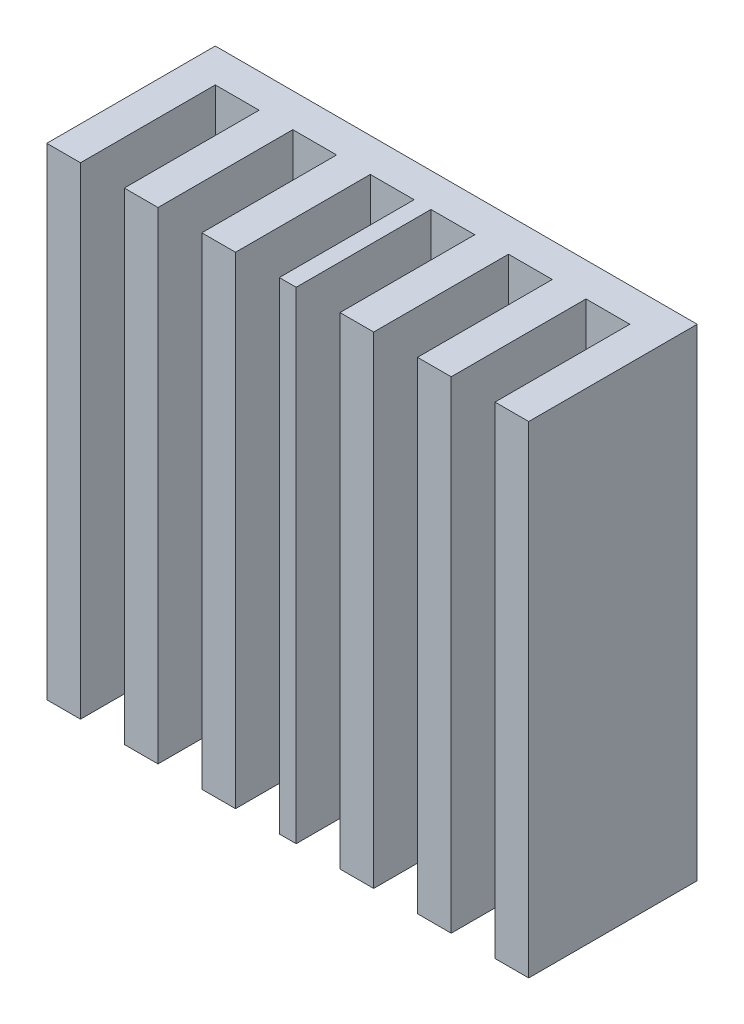
ISO-10303-21;
HEADER;
FILE_DESCRIPTION(('STEP AP214'),'2;1');
FILE_NAME('part.step','',(''),(''),'','','');
FILE_SCHEMA(('AUTOMOTIVE_DESIGN { 1 0 10303 214 1 1 1 1 }'));
ENDSEC;
DATA;
#1=APPLICATION_CONTEXT('core data for automotive mechanical design processes');
#2=APPLICATION_PROTOCOL_DEFINITION('international standard','automotive_design',2000,#1);
#3=PRODUCT_CONTEXT('',#1,'mechanical');
#4=PRODUCT('Part','Part','',(#3));
#5=PRODUCT_RELATED_PRODUCT_CATEGORY('part','',(#4));
#6=PRODUCT_DEFINITION_FORMATION('','',#4);
#7=PRODUCT_DEFINITION_CONTEXT('part definition',#1,'design');
#8=PRODUCT_DEFINITION('design','',#6,#7);
#9=PRODUCT_DEFINITION_SHAPE('','',#8);
#10=(LENGTH_UNIT() NAMED_UNIT(*) SI_UNIT(.MILLI.,.METRE.));
#11=(NAMED_UNIT(*) PLANE_ANGLE_UNIT() SI_UNIT($,.RADIAN.));
#12=(NAMED_UNIT(*) SI_UNIT($,.STERADIAN.) SOLID_ANGLE_UNIT());
#13=UNCERTAINTY_MEASURE_WITH_UNIT(LENGTH_MEASURE(1.E-05),#10,'distance_accuracy_value','');
#14=(GEOMETRIC_REPRESENTATION_CONTEXT(3) GLOBAL_UNCERTAINTY_ASSIGNED_CONTEXT((#13)) GLOBAL_UNIT_ASSIGNED_CONTEXT((#10,
#11,#12)) REPRESENTATION_CONTEXT('',''));
#15=CARTESIAN_POINT('',(0.,0.,0.));
#16=DIRECTION('',(0.,0.,1.));
#17=DIRECTION('',(1.,0.,0.));
#18=AXIS2_PLACEMENT_3D('',#15,#16,#17);
#19=CARTESIAN_POINT('',(0.,0.,5.));
#20=DIRECTION('',(0.,0.,-1.));
#21=DIRECTION('',(-1.,0.,0.));
#22=AXIS2_PLACEMENT_3D('',#19,#20,#21);
#23=PLANE('',#22);
#24=DIRECTION('',(-1.,0.,0.));
#25=VECTOR('',#24,1.);
#26=CARTESIAN_POINT('',(0.,14.3,5.));
#27=LINE('',#26,#25);
#28=CARTESIAN_POINT('',(14.3,14.3,5.));
#29=VERTEX_POINT('',#28);
#30=CARTESIAN_POINT('',(13.3,14.3,5.));
#31=VERTEX_POINT('',#30);
#32=EDGE_CURVE('E389',#29,#31,#27,.T.);
#33=ORIENTED_EDGE('',*,*,#32,.T.);
#34=DIRECTION('',(0.,1.,0.));
#35=VECTOR('',#34,1.);
#36=CARTESIAN_POINT('',(13.3,14.3,5.));
#37=LINE('',#36,#35);
#38=CARTESIAN_POINT('',(13.3,0.,5.));
#39=VERTEX_POINT('',#38);
#40=EDGE_CURVE('E234',#39,#31,#37,.T.);
#41=ORIENTED_EDGE('',*,*,#40,.F.);
#42=DIRECTION('',(1.,0.,0.));
#43=VECTOR('',#42,1.);
#44=CARTESIAN_POINT('',(0.,0.,5.));
#45=LINE('',#44,#43);
#46=CARTESIAN_POINT('',(14.3,0.,5.));
#47=VERTEX_POINT('',#46);
#48=EDGE_CURVE('E380',#39,#47,#45,.T.);
#49=ORIENTED_EDGE('',*,*,#48,.T.);
#50=DIRECTION('',(0.,1.,0.));
#51=VECTOR('',#50,1.);
#52=CARTESIAN_POINT('',(14.3,0.,5.));
#53=LINE('',#52,#51);
#54=EDGE_CURVE('E385',#47,#29,#53,.T.);
#55=ORIENTED_EDGE('',*,*,#54,.T.);
#56=EDGE_LOOP('',(#33,#41,#49,#55));
#57=FACE_BOUND('',#56,.T.);
#58=ADVANCED_FACE('F33',(#57),#23,.F.);
#59=CARTESIAN_POINT('',(11.,0.,5.));
#60=VERTEX_POINT('',#59);
#61=CARTESIAN_POINT('',(12.,0.,5.));
#62=VERTEX_POINT('',#61);
#63=EDGE_CURVE('E464',#60,#62,#45,.T.);
#64=ORIENTED_EDGE('',*,*,#63,.T.);
#65=DIRECTION('',(0.,-1.,0.));
#66=VECTOR('',#65,1.);
#67=CARTESIAN_POINT('',(12.,14.3,5.));
#68=LINE('',#67,#66);
#69=CARTESIAN_POINT('',(12.,14.3,5.));
#70=VERTEX_POINT('',#69);
#71=EDGE_CURVE('E452',#70,#62,#68,.T.);
#72=ORIENTED_EDGE('',*,*,#71,.F.);
#73=CARTESIAN_POINT('',(11.,14.3,5.));
#74=VERTEX_POINT('',#73);
#75=EDGE_CURVE('E239',#70,#74,#27,.T.);
#76=ORIENTED_EDGE('',*,*,#75,.T.);
#77=DIRECTION('',(0.,1.,0.));
#78=VECTOR('',#77,1.);
#79=CARTESIAN_POINT('',(11.,14.3,5.));
#80=LINE('',#79,#78);
#81=EDGE_CURVE('E249',#60,#74,#80,.T.);
#82=ORIENTED_EDGE('',*,*,#81,.F.);
#83=EDGE_LOOP('',(#64,#72,#76,#82));
#84=FACE_BOUND('',#83,.T.);
#85=ADVANCED_FACE('F450',(#84),#23,.F.);
#86=CARTESIAN_POINT('',(8.7,0.,5.));
#87=VERTEX_POINT('',#86);
#88=CARTESIAN_POINT('',(9.7,0.,5.));
#89=VERTEX_POINT('',#88);
#90=EDGE_CURVE('E465',#87,#89,#45,.T.);
#91=ORIENTED_EDGE('',*,*,#90,.T.);
#92=DIRECTION('',(0.,-1.,0.));
#93=VECTOR('',#92,1.);
#94=CARTESIAN_POINT('',(9.7,14.3,5.));
#95=LINE('',#94,#93);
#96=CARTESIAN_POINT('',(9.7,14.3,5.));
#97=VERTEX_POINT('',#96);
#98=EDGE_CURVE('E256',#97,#89,#95,.T.);
#99=ORIENTED_EDGE('',*,*,#98,.F.);
#100=CARTESIAN_POINT('',(8.7,14.3,5.));
#101=VERTEX_POINT('',#100);
#102=EDGE_CURVE('E438',#97,#101,#27,.T.);
#103=ORIENTED_EDGE('',*,*,#102,.T.);
#104=DIRECTION('',(0.,1.,0.));
#105=VECTOR('',#104,1.);
#106=CARTESIAN_POINT('',(8.7,14.3,5.));
#107=LINE('',#106,#105);
#108=EDGE_CURVE('E274',#87,#101,#107,.T.);
#109=ORIENTED_EDGE('',*,*,#108,.F.);
#110=EDGE_LOOP('',(#91,#99,#103,#109));
#111=FACE_BOUND('',#110,.T.);
#112=ADVANCED_FACE('F492',(#111),#23,.F.);
#113=CARTESIAN_POINT('',(4.6,0.,5.));
#114=VERTEX_POINT('',#113);
#115=CARTESIAN_POINT('',(5.6,0.,5.));
#116=VERTEX_POINT('',#115);
#117=EDGE_CURVE('E516',#114,#116,#45,.T.);
#118=ORIENTED_EDGE('',*,*,#117,.T.);
#119=DIRECTION('',(0.,-1.,0.));
#120=VECTOR('',#119,1.);
#121=CARTESIAN_POINT('',(5.6,14.3,5.));
#122=LINE('',#121,#120);
#123=CARTESIAN_POINT('',(5.6,14.3,5.));
#124=VERTEX_POINT('',#123);
#125=EDGE_CURVE('E289',#124,#116,#122,.T.);
#126=ORIENTED_EDGE('',*,*,#125,.F.);
#127=CARTESIAN_POINT('',(4.6,14.3,5.));
#128=VERTEX_POINT('',#127);
#129=EDGE_CURVE('E428',#124,#128,#27,.T.);
#130=ORIENTED_EDGE('',*,*,#129,.T.);
#131=DIRECTION('',(0.,1.,0.));
#132=VECTOR('',#131,1.);
#133=CARTESIAN_POINT('',(4.6,14.3,5.));
#134=LINE('',#133,#132);
#135=EDGE_CURVE('E327',#114,#128,#134,.T.);
#136=ORIENTED_EDGE('',*,*,#135,.F.);
#137=EDGE_LOOP('',(#118,#126,#130,#136));
#138=FACE_BOUND('',#137,.T.);
#139=ADVANCED_FACE('F509',(#138),#23,.F.);
#140=CARTESIAN_POINT('',(2.3,0.,5.));
#141=VERTEX_POINT('',#140);
#142=CARTESIAN_POINT('',(3.3,0.,5.));
#143=VERTEX_POINT('',#142);
#144=EDGE_CURVE('E386',#141,#143,#45,.T.);
#145=ORIENTED_EDGE('',*,*,#144,.T.);
#146=DIRECTION('',(0.,-1.,0.));
#147=VECTOR('',#146,1.);
#148=CARTESIAN_POINT('',(3.3,14.3,5.));
#149=LINE('',#148,#147);
#150=CARTESIAN_POINT('',(3.3,14.3,5.));
#151=VERTEX_POINT('',#150);
#152=EDGE_CURVE('E315',#151,#143,#149,.T.);
#153=ORIENTED_EDGE('',*,*,#152,.F.);
#154=CARTESIAN_POINT('',(2.3,14.3,5.));
#155=VERTEX_POINT('',#154);
#156=EDGE_CURVE('E427',#151,#155,#27,.T.);
#157=ORIENTED_EDGE('',*,*,#156,.T.);
#158=DIRECTION('',(0.,1.,0.));
#159=VECTOR('',#158,1.);
#160=CARTESIAN_POINT('',(2.3,14.3,5.));
#161=LINE('',#160,#159);
#162=EDGE_CURVE('E354',#141,#155,#161,.T.);
#163=ORIENTED_EDGE('',*,*,#162,.F.);
#164=EDGE_LOOP('',(#145,#153,#157,#163));
#165=FACE_BOUND('',#164,.T.);
#166=ADVANCED_FACE('F504',(#165),#23,.F.);
#167=CARTESIAN_POINT('',(0.,0.,5.));
#168=VERTEX_POINT('',#167);
#169=CARTESIAN_POINT('',(1.,0.,5.));
#170=VERTEX_POINT('',#169);
#171=EDGE_CURVE('E382',#168,#170,#45,.T.);
#172=ORIENTED_EDGE('',*,*,#171,.T.);
#173=DIRECTION('',(0.,-1.,0.));
#174=VECTOR('',#173,1.);
#175=CARTESIAN_POINT('',(1.,14.3,5.));
#176=LINE('',#175,#174);
#177=CARTESIAN_POINT('',(1.,14.3,5.));
#178=VERTEX_POINT('',#177);
#179=EDGE_CURVE('E342',#178,#170,#176,.T.);
#180=ORIENTED_EDGE('',*,*,#179,.F.);
#181=CARTESIAN_POINT('',(0.,14.3,5.));
#182=VERTEX_POINT('',#181);
#183=EDGE_CURVE('E388',#178,#182,#27,.T.);
#184=ORIENTED_EDGE('',*,*,#183,.T.);
#185=DIRECTION('',(0.,-1.,0.));
#186=VECTOR('',#185,1.);
#187=CARTESIAN_POINT('',(0.,0.,5.));
#188=LINE('',#187,#186);
#189=EDGE_CURVE('E377',#182,#168,#188,.T.);
#190=ORIENTED_EDGE('',*,*,#189,.T.);
#191=EDGE_LOOP('',(#172,#180,#184,#190));
#192=FACE_BOUND('',#191,.T.);
#193=ADVANCED_FACE('F424',(#192),#23,.F.);
#194=CARTESIAN_POINT('',(0.,0.,5.));
#195=DIRECTION('',(1.,0.,0.));
#196=DIRECTION('',(0.,0.,-1.));
#197=AXIS2_PLACEMENT_3D('',#194,#195,#196);
#198=PLANE('',#197);
#199=DIRECTION('',(0.,-1.,0.));
#200=VECTOR('',#199,1.);
#201=CARTESIAN_POINT('',(0.,0.,0.));
#202=LINE('',#201,#200);
#203=CARTESIAN_POINT('',(0.,14.3,0.));
#204=VERTEX_POINT('',#203);
#205=CARTESIAN_POINT('',(0.,0.,0.));
#206=VERTEX_POINT('',#205);
#207=EDGE_CURVE('E369',#204,#206,#202,.T.);
#208=ORIENTED_EDGE('',*,*,#207,.T.);
#209=DIRECTION('',(0.,0.,-1.));
#210=VECTOR('',#209,1.);
#211=CARTESIAN_POINT('',(0.,0.,5.));
#212=LINE('',#211,#210);
#213=EDGE_CURVE('E11',#168,#206,#212,.T.);
#214=ORIENTED_EDGE('',*,*,#213,.F.);
#215=ORIENTED_EDGE('',*,*,#189,.F.);
#216=DIRECTION('',(0.,0.,-1.));
#217=VECTOR('',#216,1.);
#218=CARTESIAN_POINT('',(0.,14.3,5.));
#219=LINE('',#218,#217);
#220=EDGE_CURVE('E392',#182,#204,#219,.T.);
#221=ORIENTED_EDGE('',*,*,#220,.T.);
#222=EDGE_LOOP('',(#208,#214,#215,#221));
#223=FACE_BOUND('',#222,.T.);
#224=ADVANCED_FACE('F35',(#223),#198,.F.);
#225=CARTESIAN_POINT('',(0.,0.,5.));
#226=DIRECTION('',(0.,1.,0.));
#227=DIRECTION('',(0.,0.,1.));
#228=AXIS2_PLACEMENT_3D('',#225,#226,#227);
#229=PLANE('',#228);
#230=ORIENTED_EDGE('',*,*,#48,.F.);
#231=DIRECTION('',(0.,0.,1.));
#232=VECTOR('',#231,1.);
#233=CARTESIAN_POINT('',(13.3,0.,1.));
#234=LINE('',#233,#232);
#235=CARTESIAN_POINT('',(13.3,0.,1.));
#236=VERTEX_POINT('',#235);
#237=EDGE_CURVE('E241',#236,#39,#234,.T.);
#238=ORIENTED_EDGE('',*,*,#237,.F.);
#239=DIRECTION('',(1.,0.,0.));
#240=VECTOR('',#239,1.);
#241=CARTESIAN_POINT('',(13.3,0.,1.));
#242=LINE('',#241,#240);
#243=CARTESIAN_POINT('',(12.,0.,1.));
#244=VERTEX_POINT('',#243);
#245=EDGE_CURVE('E227',#244,#236,#242,.T.);
#246=ORIENTED_EDGE('',*,*,#245,.F.);
#247=DIRECTION('',(0.,0.,1.));
#248=VECTOR('',#247,1.);
#249=CARTESIAN_POINT('',(12.,0.,1.));
#250=LINE('',#249,#248);
#251=EDGE_CURVE('E225',#244,#62,#250,.T.);
#252=ORIENTED_EDGE('',*,*,#251,.T.);
#253=ORIENTED_EDGE('',*,*,#63,.F.);
#254=DIRECTION('',(0.,0.,1.));
#255=VECTOR('',#254,1.);
#256=CARTESIAN_POINT('',(11.,0.,1.));
#257=LINE('',#256,#255);
#258=CARTESIAN_POINT('',(11.,0.,1.));
#259=VERTEX_POINT('',#258);
#260=EDGE_CURVE('E264',#259,#60,#257,.T.);
#261=ORIENTED_EDGE('',*,*,#260,.F.);
#262=DIRECTION('',(1.,0.,0.));
#263=VECTOR('',#262,1.);
#264=CARTESIAN_POINT('',(11.,0.,1.));
#265=LINE('',#264,#263);
#266=CARTESIAN_POINT('',(9.7,0.,1.));
#267=VERTEX_POINT('',#266);
#268=EDGE_CURVE('E252',#267,#259,#265,.T.);
#269=ORIENTED_EDGE('',*,*,#268,.F.);
#270=DIRECTION('',(0.,0.,1.));
#271=VECTOR('',#270,1.);
#272=CARTESIAN_POINT('',(9.7,0.,1.));
#273=LINE('',#272,#271);
#274=EDGE_CURVE('E266',#267,#89,#273,.T.);
#275=ORIENTED_EDGE('',*,*,#274,.T.);
#276=ORIENTED_EDGE('',*,*,#90,.F.);
#277=DIRECTION('',(0.,0.,1.));
#278=VECTOR('',#277,1.);
#279=CARTESIAN_POINT('',(8.7,0.,1.));
#280=LINE('',#279,#278);
#281=CARTESIAN_POINT('',(8.7,0.,1.));
#282=VERTEX_POINT('',#281);
#283=EDGE_CURVE('E290',#282,#87,#280,.T.);
#284=ORIENTED_EDGE('',*,*,#283,.F.);
#285=DIRECTION('',(1.,0.,0.));
#286=VECTOR('',#285,1.);
#287=CARTESIAN_POINT('',(8.7,0.,1.));
#288=LINE('',#287,#286);
#289=CARTESIAN_POINT('',(7.4,0.,1.));
#290=VERTEX_POINT('',#289);
#291=EDGE_CURVE('E277',#290,#282,#288,.T.);
#292=ORIENTED_EDGE('',*,*,#291,.F.);
#293=DIRECTION('',(0.,0.,1.));
#294=VECTOR('',#293,1.);
#295=CARTESIAN_POINT('',(7.4,0.,1.));
#296=LINE('',#295,#294);
#297=CARTESIAN_POINT('',(7.4,0.,5.));
#298=VERTEX_POINT('',#297);
#299=EDGE_CURVE('E292',#290,#298,#296,.T.);
#300=ORIENTED_EDGE('',*,*,#299,.T.);
#301=CARTESIAN_POINT('',(6.9,0.,5.));
#302=VERTEX_POINT('',#301);
#303=EDGE_CURVE('E466',#302,#298,#45,.T.);
#304=ORIENTED_EDGE('',*,*,#303,.F.);
#305=DIRECTION('',(0.,0.,1.));
#306=VECTOR('',#305,1.);
#307=CARTESIAN_POINT('',(6.9,0.,1.));
#308=LINE('',#307,#306);
#309=CARTESIAN_POINT('',(6.9,0.,1.));
#310=VERTEX_POINT('',#309);
#311=EDGE_CURVE('E319',#310,#302,#308,.T.);
#312=ORIENTED_EDGE('',*,*,#311,.F.);
#313=DIRECTION('',(1.,0.,0.));
#314=VECTOR('',#313,1.);
#315=CARTESIAN_POINT('',(5.6,0.,1.));
#316=LINE('',#315,#314);
#317=CARTESIAN_POINT('',(5.6,0.,1.));
#318=VERTEX_POINT('',#317);
#319=EDGE_CURVE('E299',#318,#310,#316,.T.);
#320=ORIENTED_EDGE('',*,*,#319,.F.);
#321=DIRECTION('',(0.,0.,1.));
#322=VECTOR('',#321,1.);
#323=CARTESIAN_POINT('',(5.6,0.,1.));
#324=LINE('',#323,#322);
#325=EDGE_CURVE('E309',#318,#116,#324,.T.);
#326=ORIENTED_EDGE('',*,*,#325,.T.);
#327=ORIENTED_EDGE('',*,*,#117,.F.);
#328=DIRECTION('',(0.,0.,1.));
#329=VECTOR('',#328,1.);
#330=CARTESIAN_POINT('',(4.6,0.,1.));
#331=LINE('',#330,#329);
#332=CARTESIAN_POINT('',(4.6,0.,1.));
#333=VERTEX_POINT('',#332);
#334=EDGE_CURVE('E346',#333,#114,#331,.T.);
#335=ORIENTED_EDGE('',*,*,#334,.F.);
#336=DIRECTION('',(1.,0.,0.));
#337=VECTOR('',#336,1.);
#338=CARTESIAN_POINT('',(3.3,0.,1.));
#339=LINE('',#338,#337);
#340=CARTESIAN_POINT('',(3.3,0.,1.));
#341=VERTEX_POINT('',#340);
#342=EDGE_CURVE('E326',#341,#333,#339,.T.);
#343=ORIENTED_EDGE('',*,*,#342,.F.);
#344=DIRECTION('',(0.,0.,1.));
#345=VECTOR('',#344,1.);
#346=CARTESIAN_POINT('',(3.3,0.,1.));
#347=LINE('',#346,#345);
#348=EDGE_CURVE('E336',#341,#143,#347,.T.);
#349=ORIENTED_EDGE('',*,*,#348,.T.);
#350=ORIENTED_EDGE('',*,*,#144,.F.);
#351=DIRECTION('',(0.,0.,1.));
#352=VECTOR('',#351,1.);
#353=CARTESIAN_POINT('',(2.3,0.,1.));
#354=LINE('',#353,#352);
#355=CARTESIAN_POINT('',(2.3,0.,1.));
#356=VERTEX_POINT('',#355);
#357=EDGE_CURVE('E373',#356,#141,#354,.T.);
#358=ORIENTED_EDGE('',*,*,#357,.F.);
#359=DIRECTION('',(1.,0.,0.));
#360=VECTOR('',#359,1.);
#361=CARTESIAN_POINT('',(1.,0.,1.));
#362=LINE('',#361,#360);
#363=CARTESIAN_POINT('',(1.,0.,1.));
#364=VERTEX_POINT('',#363);
#365=EDGE_CURVE('E353',#364,#356,#362,.T.);
#366=ORIENTED_EDGE('',*,*,#365,.F.);
#367=DIRECTION('',(0.,0.,1.));
#368=VECTOR('',#367,1.);
#369=CARTESIAN_POINT('',(1.,0.,1.));
#370=LINE('',#369,#368);
#371=EDGE_CURVE('E363',#364,#170,#370,.T.);
#372=ORIENTED_EDGE('',*,*,#371,.T.);
#373=ORIENTED_EDGE('',*,*,#171,.F.);
#374=ORIENTED_EDGE('',*,*,#213,.T.);
#375=DIRECTION('',(1.,0.,0.));
#376=VECTOR('',#375,1.);
#377=CARTESIAN_POINT('',(0.,0.,0.));
#378=LINE('',#377,#376);
#379=CARTESIAN_POINT('',(14.3,0.,0.));
#380=VERTEX_POINT('',#379);
#381=EDGE_CURVE('E395',#206,#380,#378,.T.);
#382=ORIENTED_EDGE('',*,*,#381,.T.);
#383=DIRECTION('',(0.,0.,-1.));
#384=VECTOR('',#383,1.);
#385=CARTESIAN_POINT('',(14.3,0.,5.));
#386=LINE('',#385,#384);
#387=EDGE_CURVE('E41',#47,#380,#386,.T.);
#388=ORIENTED_EDGE('',*,*,#387,.F.);
#389=EDGE_LOOP('',(#230,#238,#246,#252,#253,#261,#269,#275,#276,#284,#292,#300,#304,#312,#320,
#326,#327,#335,#343,#349,#350,#358,#366,#372,#373,#374,#382,#388));
#390=FACE_BOUND('',#389,.T.);
#391=ADVANCED_FACE('F461',(#390),#229,.F.);
#392=CARTESIAN_POINT('',(14.3,0.,5.));
#393=DIRECTION('',(-1.,0.,0.));
#394=DIRECTION('',(0.,0.,1.));
#395=AXIS2_PLACEMENT_3D('',#392,#393,#394);
#396=PLANE('',#395);
#397=DIRECTION('',(0.,1.,0.));
#398=VECTOR('',#397,1.);
#399=CARTESIAN_POINT('',(14.3,0.,0.));
#400=LINE('',#399,#398);
#401=CARTESIAN_POINT('',(14.3,14.3,0.));
#402=VERTEX_POINT('',#401);
#403=EDGE_CURVE('E397',#380,#402,#400,.T.);
#404=ORIENTED_EDGE('',*,*,#403,.T.);
#405=DIRECTION('',(0.,0.,-1.));
#406=VECTOR('',#405,1.);
#407=CARTESIAN_POINT('',(14.3,14.3,5.));
#408=LINE('',#407,#406);
#409=EDGE_CURVE('E402',#29,#402,#408,.T.);
#410=ORIENTED_EDGE('',*,*,#409,.F.);
#411=ORIENTED_EDGE('',*,*,#54,.F.);
#412=ORIENTED_EDGE('',*,*,#387,.T.);
#413=EDGE_LOOP('',(#404,#410,#411,#412));
#414=FACE_BOUND('',#413,.T.);
#415=ADVANCED_FACE('F409',(#414),#396,.F.);
#416=CARTESIAN_POINT('',(0.,14.3,5.));
#417=DIRECTION('',(0.,-1.,0.));
#418=DIRECTION('',(0.,0.,-1.));
#419=AXIS2_PLACEMENT_3D('',#416,#417,#418);
#420=PLANE('',#419);
#421=DIRECTION('',(-1.,0.,0.));
#422=VECTOR('',#421,1.);
#423=CARTESIAN_POINT('',(13.3,14.3,1.));
#424=LINE('',#423,#422);
#425=CARTESIAN_POINT('',(13.3,14.3,1.));
#426=VERTEX_POINT('',#425);
#427=CARTESIAN_POINT('',(12.,14.3,1.));
#428=VERTEX_POINT('',#427);
#429=EDGE_CURVE('E228',#426,#428,#424,.T.);
#430=ORIENTED_EDGE('',*,*,#429,.F.);
#431=DIRECTION('',(0.,0.,1.));
#432=VECTOR('',#431,1.);
#433=CARTESIAN_POINT('',(13.3,14.3,1.));
#434=LINE('',#433,#432);
#435=EDGE_CURVE('E258',#426,#31,#434,.T.);
#436=ORIENTED_EDGE('',*,*,#435,.T.);
#437=ORIENTED_EDGE('',*,*,#32,.F.);
#438=ORIENTED_EDGE('',*,*,#409,.T.);
#439=DIRECTION('',(-1.,0.,0.));
#440=VECTOR('',#439,1.);
#441=CARTESIAN_POINT('',(0.,14.3,0.));
#442=LINE('',#441,#440);
#443=EDGE_CURVE('E381',#402,#204,#442,.T.);
#444=ORIENTED_EDGE('',*,*,#443,.T.);
#445=ORIENTED_EDGE('',*,*,#220,.F.);
#446=ORIENTED_EDGE('',*,*,#183,.F.);
#447=DIRECTION('',(0.,0.,1.));
#448=VECTOR('',#447,1.);
#449=CARTESIAN_POINT('',(1.,14.3,1.));
#450=LINE('',#449,#448);
#451=CARTESIAN_POINT('',(1.,14.3,1.));
#452=VERTEX_POINT('',#451);
#453=EDGE_CURVE('E367',#452,#178,#450,.T.);
#454=ORIENTED_EDGE('',*,*,#453,.F.);
#455=DIRECTION('',(-1.,0.,0.));
#456=VECTOR('',#455,1.);
#457=CARTESIAN_POINT('',(1.,14.3,1.));
#458=LINE('',#457,#456);
#459=CARTESIAN_POINT('',(2.3,14.3,1.));
#460=VERTEX_POINT('',#459);
#461=EDGE_CURVE('E360',#460,#452,#458,.T.);
#462=ORIENTED_EDGE('',*,*,#461,.F.);
#463=DIRECTION('',(0.,0.,1.));
#464=VECTOR('',#463,1.);
#465=CARTESIAN_POINT('',(2.3,14.3,1.));
#466=LINE('',#465,#464);
#467=EDGE_CURVE('E370',#460,#155,#466,.T.);
#468=ORIENTED_EDGE('',*,*,#467,.T.);
#469=ORIENTED_EDGE('',*,*,#156,.F.);
#470=DIRECTION('',(0.,0.,1.));
#471=VECTOR('',#470,1.);
#472=CARTESIAN_POINT('',(3.3,14.3,1.));
#473=LINE('',#472,#471);
#474=CARTESIAN_POINT('',(3.3,14.3,1.));
#475=VERTEX_POINT('',#474);
#476=EDGE_CURVE('E340',#475,#151,#473,.T.);
#477=ORIENTED_EDGE('',*,*,#476,.F.);
#478=DIRECTION('',(-1.,0.,0.));
#479=VECTOR('',#478,1.);
#480=CARTESIAN_POINT('',(3.3,14.3,1.));
#481=LINE('',#480,#479);
#482=CARTESIAN_POINT('',(4.6,14.3,1.));
#483=VERTEX_POINT('',#482);
#484=EDGE_CURVE('E333',#483,#475,#481,.T.);
#485=ORIENTED_EDGE('',*,*,#484,.F.);
#486=DIRECTION('',(0.,0.,1.));
#487=VECTOR('',#486,1.);
#488=CARTESIAN_POINT('',(4.6,14.3,1.));
#489=LINE('',#488,#487);
#490=EDGE_CURVE('E343',#483,#128,#489,.T.);
#491=ORIENTED_EDGE('',*,*,#490,.T.);
#492=ORIENTED_EDGE('',*,*,#129,.F.);
#493=DIRECTION('',(0.,0.,1.));
#494=VECTOR('',#493,1.);
#495=CARTESIAN_POINT('',(5.6,14.3,1.));
#496=LINE('',#495,#494);
#497=CARTESIAN_POINT('',(5.6,14.3,1.));
#498=VERTEX_POINT('',#497);
#499=EDGE_CURVE('E313',#498,#124,#496,.T.);
#500=ORIENTED_EDGE('',*,*,#499,.F.);
#501=DIRECTION('',(-1.,0.,0.));
#502=VECTOR('',#501,1.);
#503=CARTESIAN_POINT('',(5.6,14.3,1.));
#504=LINE('',#503,#502);
#505=CARTESIAN_POINT('',(6.9,14.3,1.));
#506=VERTEX_POINT('',#505);
#507=EDGE_CURVE('E306',#506,#498,#504,.T.);
#508=ORIENTED_EDGE('',*,*,#507,.F.);
#509=DIRECTION('',(0.,0.,1.));
#510=VECTOR('',#509,1.);
#511=CARTESIAN_POINT('',(6.9,14.3,1.));
#512=LINE('',#511,#510);
#513=CARTESIAN_POINT('',(6.9,14.3,5.));
#514=VERTEX_POINT('',#513);
#515=EDGE_CURVE('E316',#506,#514,#512,.T.);
#516=ORIENTED_EDGE('',*,*,#515,.T.);
#517=CARTESIAN_POINT('',(7.4,14.3,5.));
#518=VERTEX_POINT('',#517);
#519=EDGE_CURVE('E433',#518,#514,#27,.T.);
#520=ORIENTED_EDGE('',*,*,#519,.F.);
#521=DIRECTION('',(0.,0.,1.));
#522=VECTOR('',#521,1.);
#523=CARTESIAN_POINT('',(7.4,14.3,1.));
#524=LINE('',#523,#522);
#525=CARTESIAN_POINT('',(7.4,14.3,1.));
#526=VERTEX_POINT('',#525);
#527=EDGE_CURVE('E282',#526,#518,#524,.T.);
#528=ORIENTED_EDGE('',*,*,#527,.F.);
#529=DIRECTION('',(-1.,0.,0.));
#530=VECTOR('',#529,1.);
#531=CARTESIAN_POINT('',(8.7,14.3,1.));
#532=LINE('',#531,#530);
#533=CARTESIAN_POINT('',(8.7,14.3,1.));
#534=VERTEX_POINT('',#533);
#535=EDGE_CURVE('E270',#534,#526,#532,.T.);
#536=ORIENTED_EDGE('',*,*,#535,.F.);
#537=DIRECTION('',(0.,0.,1.));
#538=VECTOR('',#537,1.);
#539=CARTESIAN_POINT('',(8.7,14.3,1.));
#540=LINE('',#539,#538);
#541=EDGE_CURVE('E286',#534,#101,#540,.T.);
#542=ORIENTED_EDGE('',*,*,#541,.T.);
#543=ORIENTED_EDGE('',*,*,#102,.F.);
#544=DIRECTION('',(0.,0.,1.));
#545=VECTOR('',#544,1.);
#546=CARTESIAN_POINT('',(9.7,14.3,1.));
#547=LINE('',#546,#545);
#548=CARTESIAN_POINT('',(9.7,14.3,1.));
#549=VERTEX_POINT('',#548);
#550=EDGE_CURVE('E255',#549,#97,#547,.T.);
#551=ORIENTED_EDGE('',*,*,#550,.F.);
#552=DIRECTION('',(-1.,0.,0.));
#553=VECTOR('',#552,1.);
#554=CARTESIAN_POINT('',(11.,14.3,1.));
#555=LINE('',#554,#553);
#556=CARTESIAN_POINT('',(11.,14.3,1.));
#557=VERTEX_POINT('',#556);
#558=EDGE_CURVE('E246',#557,#549,#555,.T.);
#559=ORIENTED_EDGE('',*,*,#558,.F.);
#560=DIRECTION('',(0.,0.,1.));
#561=VECTOR('',#560,1.);
#562=CARTESIAN_POINT('',(11.,14.3,1.));
#563=LINE('',#562,#561);
#564=EDGE_CURVE('E261',#557,#74,#563,.T.);
#565=ORIENTED_EDGE('',*,*,#564,.T.);
#566=ORIENTED_EDGE('',*,*,#75,.F.);
#567=DIRECTION('',(0.,0.,1.));
#568=VECTOR('',#567,1.);
#569=CARTESIAN_POINT('',(12.,14.3,1.));
#570=LINE('',#569,#568);
#571=EDGE_CURVE('E222',#428,#70,#570,.T.);
#572=ORIENTED_EDGE('',*,*,#571,.F.);
#573=EDGE_LOOP('',(#430,#436,#437,#438,#444,#445,#446,#454,#462,#468,#469,#477,#485,#491,#492,
#500,#508,#516,#520,#528,#536,#542,#543,#551,#559,#565,#566,#572));
#574=FACE_BOUND('',#573,.T.);
#575=ADVANCED_FACE('F237',(#574),#420,.F.);
#576=ORIENTED_EDGE('',*,*,#303,.T.);
#577=DIRECTION('',(0.,-1.,0.));
#578=VECTOR('',#577,1.);
#579=CARTESIAN_POINT('',(7.4,14.3,5.));
#580=LINE('',#579,#578);
#581=EDGE_CURVE('E263',#518,#298,#580,.T.);
#582=ORIENTED_EDGE('',*,*,#581,.F.);
#583=ORIENTED_EDGE('',*,*,#519,.T.);
#584=DIRECTION('',(0.,1.,0.));
#585=VECTOR('',#584,1.);
#586=CARTESIAN_POINT('',(6.9,14.3,5.));
#587=LINE('',#586,#585);
#588=EDGE_CURVE('E300',#302,#514,#587,.T.);
#589=ORIENTED_EDGE('',*,*,#588,.F.);
#590=EDGE_LOOP('',(#576,#582,#583,#589));
#591=FACE_BOUND('',#590,.T.);
#592=ADVANCED_FACE('F488',(#591),#23,.F.);
#593=CARTESIAN_POINT('',(0.,0.,0.));
#594=DIRECTION('',(0.,0.,-1.));
#595=DIRECTION('',(-1.,0.,0.));
#596=AXIS2_PLACEMENT_3D('',#593,#594,#595);
#597=PLANE('',#596);
#598=ORIENTED_EDGE('',*,*,#207,.F.);
#599=ORIENTED_EDGE('',*,*,#443,.F.);
#600=ORIENTED_EDGE('',*,*,#403,.F.);
#601=ORIENTED_EDGE('',*,*,#381,.F.);
#602=EDGE_LOOP('',(#598,#599,#600,#601));
#603=FACE_BOUND('',#602,.T.);
#604=ADVANCED_FACE('F416',(#603),#597,.T.);
#605=CARTESIAN_POINT('',(1.,14.3,1.));
#606=DIRECTION('',(-1.,0.,0.));
#607=DIRECTION('',(0.,-1.,0.));
#608=AXIS2_PLACEMENT_3D('',#605,#606,#607);
#609=PLANE('',#608);
#610=ORIENTED_EDGE('',*,*,#179,.T.);
#611=ORIENTED_EDGE('',*,*,#371,.F.);
#612=DIRECTION('',(0.,-1.,0.));
#613=VECTOR('',#612,1.);
#614=CARTESIAN_POINT('',(1.,14.3,1.));
#615=LINE('',#614,#613);
#616=EDGE_CURVE('E350',#452,#364,#615,.T.);
#617=ORIENTED_EDGE('',*,*,#616,.F.);
#618=ORIENTED_EDGE('',*,*,#453,.T.);
#619=EDGE_LOOP('',(#610,#611,#617,#618));
#620=FACE_BOUND('',#619,.T.);
#621=ADVANCED_FACE('F500',(#620),#609,.F.);
#622=CARTESIAN_POINT('',(2.3,14.3,1.));
#623=DIRECTION('',(1.,0.,0.));
#624=DIRECTION('',(0.,1.,0.));
#625=AXIS2_PLACEMENT_3D('',#622,#623,#624);
#626=PLANE('',#625);
#627=ORIENTED_EDGE('',*,*,#162,.T.);
#628=ORIENTED_EDGE('',*,*,#467,.F.);
#629=DIRECTION('',(0.,1.,0.));
#630=VECTOR('',#629,1.);
#631=CARTESIAN_POINT('',(2.3,14.3,1.));
#632=LINE('',#631,#630);
#633=EDGE_CURVE('E357',#356,#460,#632,.T.);
#634=ORIENTED_EDGE('',*,*,#633,.F.);
#635=ORIENTED_EDGE('',*,*,#357,.T.);
#636=EDGE_LOOP('',(#627,#628,#634,#635));
#637=FACE_BOUND('',#636,.T.);
#638=ADVANCED_FACE('F551',(#637),#626,.F.);
#639=CARTESIAN_POINT('',(0.,0.,1.));
#640=DIRECTION('',(0.,0.,1.));
#641=DIRECTION('',(1.,0.,0.));
#642=AXIS2_PLACEMENT_3D('',#639,#640,#641);
#643=PLANE('',#642);
#644=ORIENTED_EDGE('',*,*,#616,.T.);
#645=ORIENTED_EDGE('',*,*,#365,.T.);
#646=ORIENTED_EDGE('',*,*,#633,.T.);
#647=ORIENTED_EDGE('',*,*,#461,.T.);
#648=EDGE_LOOP('',(#644,#645,#646,#647));
#649=FACE_BOUND('',#648,.T.);
#650=ADVANCED_FACE('F553',(#649),#643,.T.);
#651=CARTESIAN_POINT('',(3.3,14.3,1.));
#652=DIRECTION('',(-1.,0.,0.));
#653=DIRECTION('',(0.,-1.,0.));
#654=AXIS2_PLACEMENT_3D('',#651,#652,#653);
#655=PLANE('',#654);
#656=ORIENTED_EDGE('',*,*,#152,.T.);
#657=ORIENTED_EDGE('',*,*,#348,.F.);
#658=DIRECTION('',(0.,-1.,0.));
#659=VECTOR('',#658,1.);
#660=CARTESIAN_POINT('',(3.3,14.3,1.));
#661=LINE('',#660,#659);
#662=EDGE_CURVE('E323',#475,#341,#661,.T.);
#663=ORIENTED_EDGE('',*,*,#662,.F.);
#664=ORIENTED_EDGE('',*,*,#476,.T.);
#665=EDGE_LOOP('',(#656,#657,#663,#664));
#666=FACE_BOUND('',#665,.T.);
#667=ADVANCED_FACE('F548',(#666),#655,.F.);
#668=CARTESIAN_POINT('',(4.6,14.3,1.));
#669=DIRECTION('',(1.,0.,0.));
#670=DIRECTION('',(0.,1.,0.));
#671=AXIS2_PLACEMENT_3D('',#668,#669,#670);
#672=PLANE('',#671);
#673=ORIENTED_EDGE('',*,*,#135,.T.);
#674=ORIENTED_EDGE('',*,*,#490,.F.);
#675=DIRECTION('',(0.,1.,0.));
#676=VECTOR('',#675,1.);
#677=CARTESIAN_POINT('',(4.6,14.3,1.));
#678=LINE('',#677,#676);
#679=EDGE_CURVE('E330',#333,#483,#678,.T.);
#680=ORIENTED_EDGE('',*,*,#679,.F.);
#681=ORIENTED_EDGE('',*,*,#334,.T.);
#682=EDGE_LOOP('',(#673,#674,#680,#681));
#683=FACE_BOUND('',#682,.T.);
#684=ADVANCED_FACE('F543',(#683),#672,.F.);
#685=CARTESIAN_POINT('',(0.,0.,1.));
#686=DIRECTION('',(0.,0.,1.));
#687=DIRECTION('',(1.,0.,0.));
#688=AXIS2_PLACEMENT_3D('',#685,#686,#687);
#689=PLANE('',#688);
#690=ORIENTED_EDGE('',*,*,#662,.T.);
#691=ORIENTED_EDGE('',*,*,#342,.T.);
#692=ORIENTED_EDGE('',*,*,#679,.T.);
#693=ORIENTED_EDGE('',*,*,#484,.T.);
#694=EDGE_LOOP('',(#690,#691,#692,#693));
#695=FACE_BOUND('',#694,.T.);
#696=ADVANCED_FACE('F545',(#695),#689,.T.);
#697=CARTESIAN_POINT('',(5.6,14.3,1.));
#698=DIRECTION('',(-1.,0.,0.));
#699=DIRECTION('',(0.,-1.,0.));
#700=AXIS2_PLACEMENT_3D('',#697,#698,#699);
#701=PLANE('',#700);
#702=ORIENTED_EDGE('',*,*,#125,.T.);
#703=ORIENTED_EDGE('',*,*,#325,.F.);
#704=DIRECTION('',(0.,-1.,0.));
#705=VECTOR('',#704,1.);
#706=CARTESIAN_POINT('',(5.6,14.3,1.));
#707=LINE('',#706,#705);
#708=EDGE_CURVE('E296',#498,#318,#707,.T.);
#709=ORIENTED_EDGE('',*,*,#708,.F.);
#710=ORIENTED_EDGE('',*,*,#499,.T.);
#711=EDGE_LOOP('',(#702,#703,#709,#710));
#712=FACE_BOUND('',#711,.T.);
#713=ADVANCED_FACE('F539',(#712),#701,.F.);
#714=CARTESIAN_POINT('',(6.9,14.3,1.));
#715=DIRECTION('',(1.,0.,0.));
#716=DIRECTION('',(0.,1.,0.));
#717=AXIS2_PLACEMENT_3D('',#714,#715,#716);
#718=PLANE('',#717);
#719=ORIENTED_EDGE('',*,*,#588,.T.);
#720=ORIENTED_EDGE('',*,*,#515,.F.);
#721=DIRECTION('',(0.,1.,0.));
#722=VECTOR('',#721,1.);
#723=CARTESIAN_POINT('',(6.9,14.3,1.));
#724=LINE('',#723,#722);
#725=EDGE_CURVE('E303',#310,#506,#724,.T.);
#726=ORIENTED_EDGE('',*,*,#725,.F.);
#727=ORIENTED_EDGE('',*,*,#311,.T.);
#728=EDGE_LOOP('',(#719,#720,#726,#727));
#729=FACE_BOUND('',#728,.T.);
#730=ADVANCED_FACE('F534',(#729),#718,.F.);
#731=CARTESIAN_POINT('',(0.,0.,1.));
#732=DIRECTION('',(0.,0.,1.));
#733=DIRECTION('',(1.,0.,0.));
#734=AXIS2_PLACEMENT_3D('',#731,#732,#733);
#735=PLANE('',#734);
#736=ORIENTED_EDGE('',*,*,#708,.T.);
#737=ORIENTED_EDGE('',*,*,#319,.T.);
#738=ORIENTED_EDGE('',*,*,#725,.T.);
#739=ORIENTED_EDGE('',*,*,#507,.T.);
#740=EDGE_LOOP('',(#736,#737,#738,#739));
#741=FACE_BOUND('',#740,.T.);
#742=ADVANCED_FACE('F536',(#741),#735,.T.);
#743=CARTESIAN_POINT('',(8.7,14.3,1.));
#744=DIRECTION('',(1.,0.,0.));
#745=DIRECTION('',(0.,0.,-1.));
#746=AXIS2_PLACEMENT_3D('',#743,#744,#745);
#747=PLANE('',#746);
#748=ORIENTED_EDGE('',*,*,#108,.T.);
#749=ORIENTED_EDGE('',*,*,#541,.F.);
#750=DIRECTION('',(0.,1.,0.));
#751=VECTOR('',#750,1.);
#752=CARTESIAN_POINT('',(8.7,14.3,1.));
#753=LINE('',#752,#751);
#754=EDGE_CURVE('E279',#282,#534,#753,.T.);
#755=ORIENTED_EDGE('',*,*,#754,.F.);
#756=ORIENTED_EDGE('',*,*,#283,.T.);
#757=EDGE_LOOP('',(#748,#749,#755,#756));
#758=FACE_BOUND('',#757,.T.);
#759=ADVANCED_FACE('F576',(#758),#747,.F.);
#760=CARTESIAN_POINT('',(7.4,14.3,1.));
#761=DIRECTION('',(-1.,0.,0.));
#762=DIRECTION('',(0.,-1.,0.));
#763=AXIS2_PLACEMENT_3D('',#760,#761,#762);
#764=PLANE('',#763);
#765=ORIENTED_EDGE('',*,*,#581,.T.);
#766=ORIENTED_EDGE('',*,*,#299,.F.);
#767=DIRECTION('',(0.,-1.,0.));
#768=VECTOR('',#767,1.);
#769=CARTESIAN_POINT('',(7.4,14.3,1.));
#770=LINE('',#769,#768);
#771=EDGE_CURVE('E273',#526,#290,#770,.T.);
#772=ORIENTED_EDGE('',*,*,#771,.F.);
#773=ORIENTED_EDGE('',*,*,#527,.T.);
#774=EDGE_LOOP('',(#765,#766,#772,#773));
#775=FACE_BOUND('',#774,.T.);
#776=ADVANCED_FACE('F525',(#775),#764,.F.);
#777=CARTESIAN_POINT('',(0.,0.,1.));
#778=DIRECTION('',(0.,0.,1.));
#779=DIRECTION('',(1.,0.,0.));
#780=AXIS2_PLACEMENT_3D('',#777,#778,#779);
#781=PLANE('',#780);
#782=ORIENTED_EDGE('',*,*,#535,.T.);
#783=ORIENTED_EDGE('',*,*,#771,.T.);
#784=ORIENTED_EDGE('',*,*,#291,.T.);
#785=ORIENTED_EDGE('',*,*,#754,.T.);
#786=EDGE_LOOP('',(#782,#783,#784,#785));
#787=FACE_BOUND('',#786,.T.);
#788=ADVANCED_FACE('F527',(#787),#781,.T.);
#789=CARTESIAN_POINT('',(11.,14.3,1.));
#790=DIRECTION('',(1.,0.,0.));
#791=DIRECTION('',(0.,0.,-1.));
#792=AXIS2_PLACEMENT_3D('',#789,#790,#791);
#793=PLANE('',#792);
#794=ORIENTED_EDGE('',*,*,#81,.T.);
#795=ORIENTED_EDGE('',*,*,#564,.F.);
#796=DIRECTION('',(0.,1.,0.));
#797=VECTOR('',#796,1.);
#798=CARTESIAN_POINT('',(11.,14.3,1.));
#799=LINE('',#798,#797);
#800=EDGE_CURVE('E56',#259,#557,#799,.T.);
#801=ORIENTED_EDGE('',*,*,#800,.F.);
#802=ORIENTED_EDGE('',*,*,#260,.T.);
#803=EDGE_LOOP('',(#794,#795,#801,#802));
#804=FACE_BOUND('',#803,.T.);
#805=ADVANCED_FACE('F454',(#804),#793,.F.);
#806=CARTESIAN_POINT('',(9.7,14.3,1.));
#807=DIRECTION('',(-1.,0.,0.));
#808=DIRECTION('',(0.,-1.,0.));
#809=AXIS2_PLACEMENT_3D('',#806,#807,#808);
#810=PLANE('',#809);
#811=ORIENTED_EDGE('',*,*,#98,.T.);
#812=ORIENTED_EDGE('',*,*,#274,.F.);
#813=DIRECTION('',(0.,-1.,0.));
#814=VECTOR('',#813,1.);
#815=CARTESIAN_POINT('',(9.7,14.3,1.));
#816=LINE('',#815,#814);
#817=EDGE_CURVE('E248',#549,#267,#816,.T.);
#818=ORIENTED_EDGE('',*,*,#817,.F.);
#819=ORIENTED_EDGE('',*,*,#550,.T.);
#820=EDGE_LOOP('',(#811,#812,#818,#819));
#821=FACE_BOUND('',#820,.T.);
#822=ADVANCED_FACE('F483',(#821),#810,.F.);
#823=CARTESIAN_POINT('',(0.,0.,1.));
#824=DIRECTION('',(0.,0.,1.));
#825=DIRECTION('',(1.,0.,0.));
#826=AXIS2_PLACEMENT_3D('',#823,#824,#825);
#827=PLANE('',#826);
#828=ORIENTED_EDGE('',*,*,#558,.T.);
#829=ORIENTED_EDGE('',*,*,#817,.T.);
#830=ORIENTED_EDGE('',*,*,#268,.T.);
#831=ORIENTED_EDGE('',*,*,#800,.T.);
#832=EDGE_LOOP('',(#828,#829,#830,#831));
#833=FACE_BOUND('',#832,.T.);
#834=ADVANCED_FACE('F458',(#833),#827,.T.);
#835=CARTESIAN_POINT('',(13.3,14.3,1.));
#836=DIRECTION('',(1.,0.,0.));
#837=DIRECTION('',(0.,0.,-1.));
#838=AXIS2_PLACEMENT_3D('',#835,#836,#837);
#839=PLANE('',#838);
#840=ORIENTED_EDGE('',*,*,#40,.T.);
#841=ORIENTED_EDGE('',*,*,#435,.F.);
#842=DIRECTION('',(0.,1.,0.));
#843=VECTOR('',#842,1.);
#844=CARTESIAN_POINT('',(13.3,14.3,1.));
#845=LINE('',#844,#843);
#846=EDGE_CURVE('E48',#236,#426,#845,.T.);
#847=ORIENTED_EDGE('',*,*,#846,.F.);
#848=ORIENTED_EDGE('',*,*,#237,.T.);
#849=EDGE_LOOP('',(#840,#841,#847,#848));
#850=FACE_BOUND('',#849,.T.);
#851=ADVANCED_FACE('F475',(#850),#839,.F.);
#852=CARTESIAN_POINT('',(12.,14.3,1.));
#853=DIRECTION('',(-1.,0.,0.));
#854=DIRECTION('',(0.,-1.,0.));
#855=AXIS2_PLACEMENT_3D('',#852,#853,#854);
#856=PLANE('',#855);
#857=ORIENTED_EDGE('',*,*,#71,.T.);
#858=ORIENTED_EDGE('',*,*,#251,.F.);
#859=DIRECTION('',(0.,-1.,0.));
#860=VECTOR('',#859,1.);
#861=CARTESIAN_POINT('',(12.,14.3,1.));
#862=LINE('',#861,#860);
#863=EDGE_CURVE('E219',#428,#244,#862,.T.);
#864=ORIENTED_EDGE('',*,*,#863,.F.);
#865=ORIENTED_EDGE('',*,*,#571,.T.);
#866=EDGE_LOOP('',(#857,#858,#864,#865));
#867=FACE_BOUND('',#866,.T.);
#868=ADVANCED_FACE('F220',(#867),#856,.F.);
#869=CARTESIAN_POINT('',(0.,0.,1.));
#870=DIRECTION('',(0.,0.,1.));
#871=DIRECTION('',(1.,0.,0.));
#872=AXIS2_PLACEMENT_3D('',#869,#870,#871);
#873=PLANE('',#872);
#874=ORIENTED_EDGE('',*,*,#429,.T.);
#875=ORIENTED_EDGE('',*,*,#863,.T.);
#876=ORIENTED_EDGE('',*,*,#245,.T.);
#877=ORIENTED_EDGE('',*,*,#846,.T.);
#878=EDGE_LOOP('',(#874,#875,#876,#877));
#879=FACE_BOUND('',#878,.T.);
#880=ADVANCED_FACE('F231',(#879),#873,.T.);
#881=CLOSED_SHELL('',(#58,#85,#112,#139,#166,#193,#224,#391,#415,#575,#592,#604,#621,#638,#650,
#667,#684,#696,#713,#730,#742,#759,#776,#788,#805,#822,#834,#851,#868,#880));
#882=MANIFOLD_SOLID_BREP('B2',#881);
#883=ADVANCED_BREP_SHAPE_REPRESENTATION('',(#18,#882),#14);
#884=SHAPE_DEFINITION_REPRESENTATION(#9,#883);
ENDSEC;
END-ISO-10303-21;
